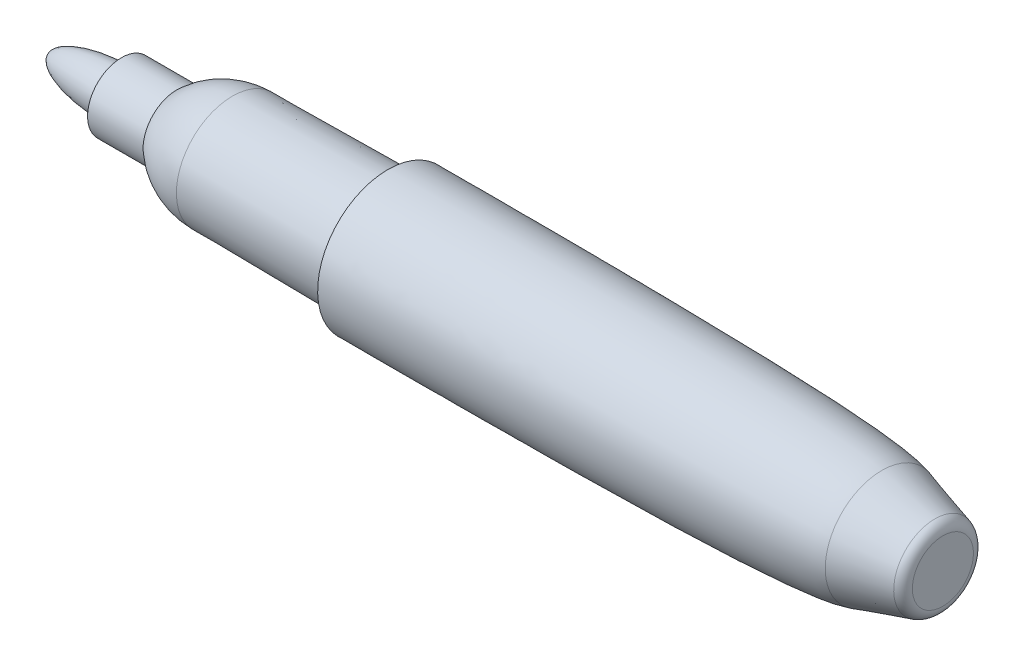
ISO-10303-21;
HEADER;
FILE_DESCRIPTION(('STEP AP214'),'2;1');
FILE_NAME('part.step','',(''),(''),'','','');
FILE_SCHEMA(('AUTOMOTIVE_DESIGN { 1 0 10303 214 1 1 1 1 }'));
ENDSEC;
DATA;
#1=APPLICATION_CONTEXT('core data for automotive mechanical design processes');
#2=APPLICATION_PROTOCOL_DEFINITION('international standard','automotive_design',2000,#1);
#3=PRODUCT_CONTEXT('',#1,'mechanical');
#4=PRODUCT('Part','Part','',(#3));
#5=PRODUCT_RELATED_PRODUCT_CATEGORY('part','',(#4));
#6=PRODUCT_DEFINITION_FORMATION('','',#4);
#7=PRODUCT_DEFINITION_CONTEXT('part definition',#1,'design');
#8=PRODUCT_DEFINITION('design','',#6,#7);
#9=PRODUCT_DEFINITION_SHAPE('','',#8);
#10=(LENGTH_UNIT() NAMED_UNIT(*) SI_UNIT(.MILLI.,.METRE.));
#11=(NAMED_UNIT(*) PLANE_ANGLE_UNIT() SI_UNIT($,.RADIAN.));
#12=(NAMED_UNIT(*) SI_UNIT($,.STERADIAN.) SOLID_ANGLE_UNIT());
#13=UNCERTAINTY_MEASURE_WITH_UNIT(LENGTH_MEASURE(1.E-05),#10,'distance_accuracy_value','');
#14=(GEOMETRIC_REPRESENTATION_CONTEXT(3) GLOBAL_UNCERTAINTY_ASSIGNED_CONTEXT((#13)) GLOBAL_UNIT_ASSIGNED_CONTEXT((#10,
#11,#12)) REPRESENTATION_CONTEXT('',''));
#15=CARTESIAN_POINT('',(0.,0.,0.));
#16=DIRECTION('',(0.,0.,1.));
#17=DIRECTION('',(1.,0.,0.));
#18=AXIS2_PLACEMENT_3D('',#15,#16,#17);
#19=CARTESIAN_POINT('',(0.,0.,0.));
#20=DIRECTION('',(1.,0.,0.));
#21=DIRECTION('',(0.,1.,0.));
#22=AXIS2_PLACEMENT_3D('',#19,#20,#21);
#23=PLANE('',#22);
#24=CARTESIAN_POINT('',(0.,0.,0.));
#25=DIRECTION('',(1.,0.,0.));
#26=DIRECTION('',(0.,1.,0.));
#27=AXIS2_PLACEMENT_3D('',#24,#25,#26);
#28=CIRCLE('',#27,2.75);
#29=CARTESIAN_POINT('',(0.,2.75,0.));
#30=VERTEX_POINT('',#29);
#31=EDGE_CURVE('E11',#30,#30,#28,.T.);
#32=ORIENTED_EDGE('',*,*,#31,.T.);
#33=EDGE_LOOP('',(#32));
#34=FACE_BOUND('',#33,.T.);
#35=ADVANCED_FACE('F47',(#34),#23,.T.);
#36=CARTESIAN_POINT('',(-1.,0.,0.));
#37=DIRECTION('',(1.,0.,0.));
#38=DIRECTION('',(0.,1.,0.));
#39=AXIS2_PLACEMENT_3D('',#36,#37,#38);
#40=TOROIDAL_SURFACE('',#39,2.75,1.);
#41=CARTESIAN_POINT('',(-0.720771546561602,0.,0.));
#42=DIRECTION('',(1.,0.,0.));
#43=DIRECTION('',(0.,1.,0.));
#44=AXIS2_PLACEMENT_3D('',#41,#42,#43);
#45=CIRCLE('',#44,3.71022469807353);
#46=CARTESIAN_POINT('',(-0.720771546561602,3.71022469807353,0.));
#47=VERTEX_POINT('',#46);
#48=EDGE_CURVE('E53',#47,#47,#45,.T.);
#49=ORIENTED_EDGE('',*,*,#48,.T.);
#50=EDGE_LOOP('',(#49));
#51=FACE_BOUND('',#50,.T.);
#52=ORIENTED_EDGE('',*,*,#31,.F.);
#53=EDGE_LOOP('',(#52));
#54=FACE_BOUND('',#53,.T.);
#55=ADVANCED_FACE('F90',(#51,#54),#40,.T.);
#56=CARTESIAN_POINT('',(-0.720771546561602,0.,0.));
#57=DIRECTION('',(-1.,0.,0.));
#58=DIRECTION('',(0.,-1.,0.));
#59=AXIS2_PLACEMENT_3D('',#56,#57,#58);
#60=CONICAL_SURFACE('',#59,3.71022469807353,0.282990508962111);
#61=CARTESIAN_POINT('',(-5.5,0.,0.));
#62=DIRECTION('',(1.,0.,0.));
#63=DIRECTION('',(0.,1.,0.));
#64=AXIS2_PLACEMENT_3D('',#61,#62,#63);
#65=CIRCLE('',#64,5.1);
#66=CARTESIAN_POINT('',(-5.5,5.1,0.));
#67=VERTEX_POINT('',#66);
#68=EDGE_CURVE('E85',#67,#67,#65,.T.);
#69=ORIENTED_EDGE('',*,*,#68,.T.);
#70=EDGE_LOOP('',(#69));
#71=FACE_BOUND('',#70,.T.);
#72=ORIENTED_EDGE('',*,*,#48,.F.);
#73=EDGE_LOOP('',(#72));
#74=FACE_BOUND('',#73,.T.);
#75=ADVANCED_FACE('F93',(#71,#74),#60,.T.);
#76=CARTESIAN_POINT('',(-5.5,5.1,0.));
#77=CARTESIAN_POINT('',(-9.34734487739765,6.21878830248296,0.));
#78=CARTESIAN_POINT('',(-26.9364052744911,6.32499999999999,0.));
#79=CARTESIAN_POINT('',(-50.,6.32499999999999,0.));
#80=B_SPLINE_CURVE_WITH_KNOTS('',3,(#76,#77,#78,#79),.UNSPECIFIED.,.F.,.F.,(4,4),(0.,
0.970469824176165),.UNSPECIFIED.);
#81=CARTESIAN_POINT('',(0.,0.,0.));
#82=DIRECTION('',(1.,0.,0.));
#83=AXIS1_PLACEMENT('',#81,#82);
#84=SURFACE_OF_REVOLUTION('',#80,#83);
#85=CARTESIAN_POINT('',(-50.,0.,0.));
#86=DIRECTION('',(1.,0.,0.));
#87=DIRECTION('',(0.,1.,0.));
#88=AXIS2_PLACEMENT_3D('',#85,#86,#87);
#89=CIRCLE('',#88,6.32499999999999);
#90=CARTESIAN_POINT('',(-50.,6.32499999999999,0.));
#91=VERTEX_POINT('',#90);
#92=EDGE_CURVE('E82',#91,#91,#89,.T.);
#93=ORIENTED_EDGE('',*,*,#92,.T.);
#94=EDGE_LOOP('',(#93));
#95=FACE_BOUND('',#94,.T.);
#96=ORIENTED_EDGE('',*,*,#68,.F.);
#97=EDGE_LOOP('',(#96));
#98=FACE_BOUND('',#97,.T.);
#99=ADVANCED_FACE('F95',(#95,#98),#84,.F.);
#100=CARTESIAN_POINT('',(-50.,5.19999999999999,0.));
#101=DIRECTION('',(-1.,0.,0.));
#102=DIRECTION('',(0.,-1.,0.));
#103=AXIS2_PLACEMENT_3D('',#100,#101,#102);
#104=PLANE('',#103);
#105=CARTESIAN_POINT('',(-50.,0.,0.));
#106=DIRECTION('',(1.,0.,0.));
#107=DIRECTION('',(0.,1.,0.));
#108=AXIS2_PLACEMENT_3D('',#105,#106,#107);
#109=CIRCLE('',#108,5.19999999999999);
#110=CARTESIAN_POINT('',(-50.,5.19999999999999,0.));
#111=VERTEX_POINT('',#110);
#112=EDGE_CURVE('E79',#111,#111,#109,.T.);
#113=ORIENTED_EDGE('',*,*,#112,.T.);
#114=EDGE_LOOP('',(#113));
#115=FACE_BOUND('',#114,.T.);
#116=ORIENTED_EDGE('',*,*,#92,.F.);
#117=EDGE_LOOP('',(#116));
#118=FACE_BOUND('',#117,.T.);
#119=ADVANCED_FACE('F102',(#115,#118),#104,.T.);
#120=CARTESIAN_POINT('',(-50.,0.,0.));
#121=DIRECTION('',(1.,0.,0.));
#122=DIRECTION('',(0.,1.,0.));
#123=AXIS2_PLACEMENT_3D('',#120,#121,#122);
#124=CONICAL_SURFACE('',#123,5.19999999999999,0.0107138757570998);
#125=CARTESIAN_POINT('',(-64.,0.,0.));
#126=DIRECTION('',(1.,0.,0.));
#127=DIRECTION('',(0.,1.,0.));
#128=AXIS2_PLACEMENT_3D('',#125,#126,#127);
#129=CIRCLE('',#128,5.04999999999998);
#130=CARTESIAN_POINT('',(-64.,5.04999999999999,0.));
#131=VERTEX_POINT('',#130);
#132=EDGE_CURVE('E76',#131,#131,#129,.T.);
#133=ORIENTED_EDGE('',*,*,#132,.T.);
#134=EDGE_LOOP('',(#133));
#135=FACE_BOUND('',#134,.T.);
#136=ORIENTED_EDGE('',*,*,#112,.F.);
#137=EDGE_LOOP('',(#136));
#138=FACE_BOUND('',#137,.T.);
#139=ADVANCED_FACE('F135',(#135,#138),#124,.T.);
#140=CARTESIAN_POINT('',(-63.9201834862385,0.,0.));
#141=DIRECTION('',(1.,0.,0.));
#142=DIRECTION('',(0.,1.,0.));
#143=AXIS2_PLACEMENT_3D('',#140,#141,#142);
#144=DEGENERATE_TOROIDAL_SURFACE('',#143,2.39954128440371,7.44996886059963,.F.);
#145=CARTESIAN_POINT('',(-69.,0.,0.));
#146=DIRECTION('',(1.,0.,0.));
#147=DIRECTION('',(0.,1.,0.));
#148=AXIS2_PLACEMENT_3D('',#145,#146,#147);
#149=CIRCLE('',#148,3.04999999999999);
#150=CARTESIAN_POINT('',(-69.,3.05,0.));
#151=VERTEX_POINT('',#150);
#152=EDGE_CURVE('E68',#151,#151,#149,.T.);
#153=ORIENTED_EDGE('',*,*,#152,.T.);
#154=EDGE_LOOP('',(#153));
#155=FACE_BOUND('',#154,.T.);
#156=ORIENTED_EDGE('',*,*,#132,.F.);
#157=EDGE_LOOP('',(#156));
#158=FACE_BOUND('',#157,.T.);
#159=ADVANCED_FACE('F146',(#155,#158),#144,.F.);
#160=CARTESIAN_POINT('',(0.,0.,0.));
#161=DIRECTION('',(1.,0.,0.));
#162=DIRECTION('',(0.,1.,0.));
#163=AXIS2_PLACEMENT_3D('',#160,#161,#162);
#164=CYLINDRICAL_SURFACE('',#163,3.04999999999999);
#165=CARTESIAN_POINT('',(-74.,0.,0.));
#166=DIRECTION('',(1.,0.,0.));
#167=DIRECTION('',(0.,1.,0.));
#168=AXIS2_PLACEMENT_3D('',#165,#166,#167);
#169=CIRCLE('',#168,3.04999999999999);
#170=CARTESIAN_POINT('',(-74.,3.05,0.));
#171=VERTEX_POINT('',#170);
#172=EDGE_CURVE('E65',#171,#171,#169,.T.);
#173=ORIENTED_EDGE('',*,*,#172,.T.);
#174=EDGE_LOOP('',(#173));
#175=FACE_BOUND('',#174,.T.);
#176=ORIENTED_EDGE('',*,*,#152,.F.);
#177=EDGE_LOOP('',(#176));
#178=FACE_BOUND('',#177,.T.);
#179=ADVANCED_FACE('F158',(#175,#178),#164,.T.);
#180=CARTESIAN_POINT('',(-74.,2.00000000000001,0.));
#181=DIRECTION('',(-1.,0.,0.));
#182=DIRECTION('',(0.,-1.,0.));
#183=AXIS2_PLACEMENT_3D('',#180,#181,#182);
#184=PLANE('',#183);
#185=CARTESIAN_POINT('',(-74.,0.,0.));
#186=DIRECTION('',(1.,0.,0.));
#187=DIRECTION('',(0.,1.,0.));
#188=AXIS2_PLACEMENT_3D('',#185,#186,#187);
#189=CIRCLE('',#188,2.);
#190=CARTESIAN_POINT('',(-74.,2.00000000000001,0.));
#191=VERTEX_POINT('',#190);
#192=EDGE_CURVE('E63',#191,#191,#189,.T.);
#193=ORIENTED_EDGE('',*,*,#192,.T.);
#194=EDGE_LOOP('',(#193));
#195=FACE_BOUND('',#194,.T.);
#196=ORIENTED_EDGE('',*,*,#172,.F.);
#197=EDGE_LOOP('',(#196));
#198=FACE_BOUND('',#197,.T.);
#199=ADVANCED_FACE('F59',(#195,#198),#184,.T.);
#200=CARTESIAN_POINT('',(-74.,0.,0.));
#201=DIRECTION('',(0.,0.,1.));
#202=DIRECTION('',(-1.,0.,0.));
#203=AXIS2_PLACEMENT_3D('',#200,#201,#202);
#204=ELLIPSE('',#203,6.50000000000001,2.);
#205=TRIMMED_CURVE('',#204,(PARAMETER_VALUE(3.14159265358979)),
(PARAMETER_VALUE(6.28318530717959)),.T.,.PARAMETER.);
#206=CARTESIAN_POINT('',(0.,0.,0.));
#207=DIRECTION('',(1.,0.,0.));
#208=AXIS1_PLACEMENT('',#206,#207);
#209=SURFACE_OF_REVOLUTION('',#205,#208);
#210=CARTESIAN_POINT('',(-80.5,0.,0.));
#211=VERTEX_POINT('',#210);
#212=VERTEX_LOOP('',#211);
#213=FACE_BOUND('',#212,.T.);
#214=ORIENTED_EDGE('',*,*,#192,.F.);
#215=EDGE_LOOP('',(#214));
#216=FACE_BOUND('',#215,.T.);
#217=ADVANCED_FACE('F56',(#213,#216),#209,.F.);
#218=CLOSED_SHELL('',(#35,#55,#75,#99,#119,#139,#159,#179,#199,#217));
#219=MANIFOLD_SOLID_BREP('B2',#218);
#220=ADVANCED_BREP_SHAPE_REPRESENTATION('',(#18,#219),#14);
#221=SHAPE_DEFINITION_REPRESENTATION(#9,#220);
ENDSEC;
END-ISO-10303-21;
